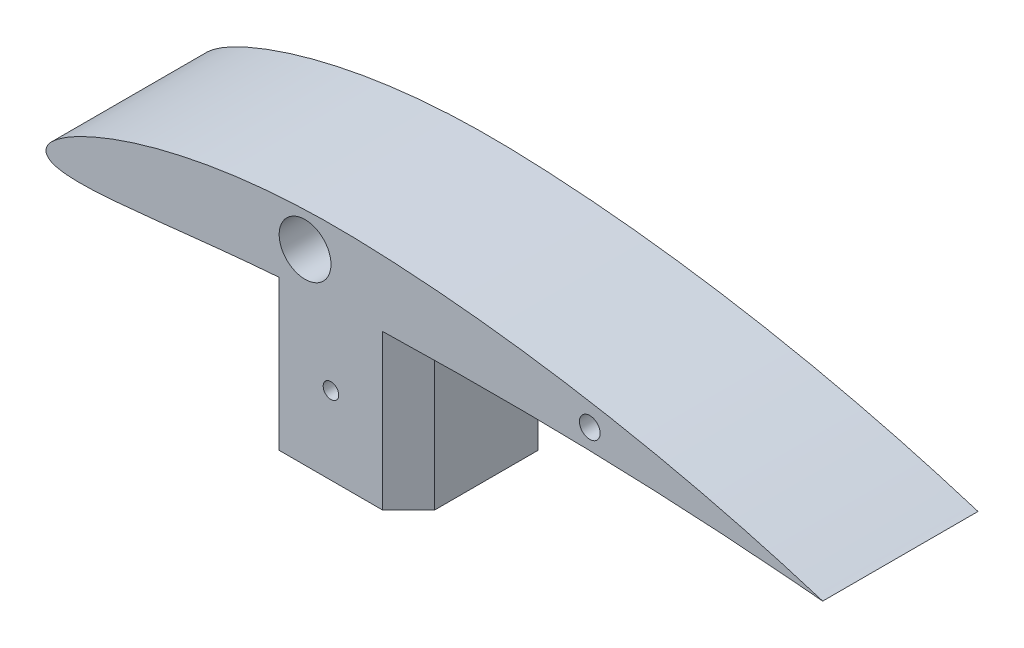
ISO-10303-21;
HEADER;
FILE_DESCRIPTION(('STEP AP214'),'2;1');
FILE_NAME('part.step','',(''),(''),'','','');
FILE_SCHEMA(('AUTOMOTIVE_DESIGN { 1 0 10303 214 1 1 1 1 }'));
ENDSEC;
DATA;
#1=APPLICATION_CONTEXT('core data for automotive mechanical design processes');
#2=APPLICATION_PROTOCOL_DEFINITION('international standard','automotive_design',2000,#1);
#3=PRODUCT_CONTEXT('',#1,'mechanical');
#4=PRODUCT('Part','Part','',(#3));
#5=PRODUCT_RELATED_PRODUCT_CATEGORY('part','',(#4));
#6=PRODUCT_DEFINITION_FORMATION('','',#4);
#7=PRODUCT_DEFINITION_CONTEXT('part definition',#1,'design');
#8=PRODUCT_DEFINITION('design','',#6,#7);
#9=PRODUCT_DEFINITION_SHAPE('','',#8);
#10=(LENGTH_UNIT() NAMED_UNIT(*) SI_UNIT(.MILLI.,.METRE.));
#11=(NAMED_UNIT(*) PLANE_ANGLE_UNIT() SI_UNIT($,.RADIAN.));
#12=(NAMED_UNIT(*) SI_UNIT($,.STERADIAN.) SOLID_ANGLE_UNIT());
#13=UNCERTAINTY_MEASURE_WITH_UNIT(LENGTH_MEASURE(1.E-05),#10,'distance_accuracy_value','');
#14=(GEOMETRIC_REPRESENTATION_CONTEXT(3) GLOBAL_UNCERTAINTY_ASSIGNED_CONTEXT((#13)) GLOBAL_UNIT_ASSIGNED_CONTEXT((#10,
#11,#12)) REPRESENTATION_CONTEXT('',''));
#15=CARTESIAN_POINT('',(0.,0.,0.));
#16=DIRECTION('',(0.,0.,1.));
#17=DIRECTION('',(1.,0.,0.));
#18=AXIS2_PLACEMENT_3D('',#15,#16,#17);
#19=CARTESIAN_POINT('',(150.,0.,30.));
#20=CARTESIAN_POINT('',(150.003329288098,0.014662249381793,30.));
#21=CARTESIAN_POINT('',(149.134973150672,0.248896496606749,30.));
#22=CARTESIAN_POINT('',(148.258218064726,0.55673636161131,30.));
#23=CARTESIAN_POINT('',(146.092264589263,1.19654633017886,30.));
#24=CARTESIAN_POINT('',(143.419462383613,1.99778912742205,30.));
#25=CARTESIAN_POINT('',(139.8973824949,3.00503852710572,30.));
#26=CARTESIAN_POINT('',(135.708200057128,4.15404129208978,30.));
#27=CARTESIAN_POINT('',(130.840351884607,5.42023236841713,30.));
#28=CARTESIAN_POINT('',(125.358407530837,6.75391320255883,30.));
#29=CARTESIAN_POINT('',(119.317026459778,8.12073918287746,30.));
#30=CARTESIAN_POINT('',(112.776533721808,9.47315641929216,30.));
#31=CARTESIAN_POINT('',(105.8081891408,10.7735530552266,30.));
#32=CARTESIAN_POINT('',(98.4852742353414,11.9821183236793,30.));
#33=CARTESIAN_POINT('',(90.8867289870229,13.0634556553686,30.));
#34=CARTESIAN_POINT('',(83.0963164113784,13.987889126777,30.));
#35=CARTESIAN_POINT('',(75.2008775632585,14.7296564652224,30.));
#36=CARTESIAN_POINT('',(67.2867045416149,15.2583026600307,30.));
#37=CARTESIAN_POINT('',(59.4020917517364,15.5949352264237,30.));
#38=CARTESIAN_POINT('',(51.630745923189,15.5985104910385,30.));
#39=CARTESIAN_POINT('',(44.0772108290214,15.1999156905343,30.));
#40=CARTESIAN_POINT('',(36.8788402768822,14.4541881360431,30.));
#41=CARTESIAN_POINT('',(30.1283124778648,13.3973016279451,30.));
#42=CARTESIAN_POINT('',(23.9108028217145,12.0836838142789,30.));
#43=CARTESIAN_POINT('',(18.3002624953933,10.5812507246044,30.));
#44=CARTESIAN_POINT('',(13.3638162704224,8.95525486581491,30.));
#45=CARTESIAN_POINT('',(9.15203164401697,7.28566296549237,30.));
#46=CARTESIAN_POINT('',(5.71179711056867,5.62797186627232,30.));
#47=CARTESIAN_POINT('',(3.05382609046227,4.06651589033411,30.));
#48=CARTESIAN_POINT('',(1.21164919063601,2.6132969274779,30.));
#49=CARTESIAN_POINT('',(0.085052112339767,1.33763685976724,30.));
#50=CARTESIAN_POINT('',(-0.180458674317127,-0.0525224950474071,30.));
#51=CARTESIAN_POINT('',(0.796524923320563,-1.07046827432894,30.));
#52=CARTESIAN_POINT('',(2.41295725296556,-1.53139163258686,30.));
#53=CARTESIAN_POINT('',(4.69512828229199,-1.80071088142852,30.));
#54=CARTESIAN_POINT('',(7.68815207852203,-1.81332682765504,30.));
#55=CARTESIAN_POINT('',(11.3620652219487,-1.62868851947792,30.));
#56=CARTESIAN_POINT('',(15.6799913776274,-1.26019933249983,30.));
#57=CARTESIAN_POINT('',(20.592376906984,-0.755998832845897,30.));
#58=CARTESIAN_POINT('',(26.0492057680031,-0.159719017170101,30.));
#59=CARTESIAN_POINT('',(31.9923782717827,0.483630714989271,30.));
#60=CARTESIAN_POINT('',(38.3681705496154,1.12082265392437,30.));
#61=CARTESIAN_POINT('',(45.1151729753294,1.69616204750979,30.));
#62=CARTESIAN_POINT('',(52.1753974691805,2.17132127896637,30.));
#63=CARTESIAN_POINT('',(59.5252685150396,2.4861103560316,30.));
#64=CARTESIAN_POINT('',(67.096034109242,2.66254785129545,30.));
#65=CARTESIAN_POINT('',(74.8069470177635,2.81955224948347,30.));
#66=CARTESIAN_POINT('',(82.5372963529707,2.89928914122949,30.));
#67=CARTESIAN_POINT('',(90.2001718911497,2.9073914753727,30.));
#68=CARTESIAN_POINT('',(97.7131039294619,2.83440001624777,30.));
#69=CARTESIAN_POINT('',(104.993995582754,2.68571683811821,30.));
#70=CARTESIAN_POINT('',(111.962787733179,2.46721579099941,30.));
#71=CARTESIAN_POINT('',(118.541868922386,2.19416658208878,30.));
#72=CARTESIAN_POINT('',(124.65666734329,1.87970597556436,30.));
#73=CARTESIAN_POINT('',(130.234494892084,1.5455926932117,30.));
#74=CARTESIAN_POINT('',(135.216199769319,1.20653216079122,30.));
#75=CARTESIAN_POINT('',(139.523505248161,0.887469492673937,30.));
#76=CARTESIAN_POINT('',(143.160651508115,0.594190169675158,30.));
#77=CARTESIAN_POINT('',(145.933395979494,0.365370935003347,30.));
#78=CARTESIAN_POINT('',(148.178013553918,0.152677435659765,30.));
#79=CARTESIAN_POINT('',(149.106467306683,0.10166923520628,30.));
#80=CARTESIAN_POINT('',(149.996691266853,-0.0145717249786521,30.));
#81=CARTESIAN_POINT('',(150.,0.,30.));
#82=B_SPLINE_CURVE_WITH_KNOTS('',3,(#19,#20,#21,#22,#23,#24,#25,#26,#27,#28,#29,#30,#31,#32,#33,
#34,#35,#36,#37,#38,#39,#40,#41,#42,#43,#44,#45,#46,#47,#48,#49,#50,#51,#52,#53,#54,#55,#56,#57,
#58,#59,#60,#61,#62,#63,#64,#65,#66,#67,#68,#69,#70,#71,#72,#73,#74,#75,#76,#77,#78,#79,#80,
#81),.UNSPECIFIED.,.T.,.F.,(4,1,1,1,1,1,1,1,1,1,1,1,1,1,1,1,1,1,1,1,1,1,1,1,1,1,1,1,1,1,1,1,1,1,
1,1,1,1,1,1,1,1,1,1,1,1,1,1,1,1,1,1,1,1,1,1,1,1,1,1,4),(0.,0.00137455348322322,
0.00548449728179397,0.0122733609908926,0.021682195504866,0.0335806119079947,0.0478307427867091,
0.0643059527211733,0.082777332043007,0.103063756455996,0.124929016786915,0.148149110667858,
0.172444694611559,0.197572105868171,0.223268880537162,0.249227774933554,0.275186209349679,
0.300900708934774,0.326462938278696,0.351222485186767,0.374905858971967,0.397269706218862,
0.418072413969665,0.437079533175026,0.454093093767394,0.468919631578705,0.48139171235289,
0.491447126518174,0.499023571234558,0.504293734329401,0.507921918342,0.511539686153778,
0.516780527527172,0.524216490268905,0.533991629403711,0.546033957270731,0.560220284382465,
0.576403357410148,0.594370816485922,0.613951103581465,0.634916884969972,0.657088503485649,
0.680229909573905,0.704175481107386,0.729090367406641,0.754353775526936,0.779667752347888,
0.804760119952374,0.829359338708985,0.853208710008459,0.876041363199166,0.897604065496152,
0.917662212410958,0.935969860405553,0.952309787739252,0.966502759006892,0.978350082728452,
0.987731492337842,0.994510920242662,0.998633932979557,1.),.UNSPECIFIED.);
#83=DIRECTION('',(0.,0.,-1.));
#84=VECTOR('',#83,1.);
#85=SURFACE_OF_LINEAR_EXTRUSION('',#82,#84);
#86=CARTESIAN_POINT('',(65.0000000000034,2.61175409979342,30.));
#87=VERTEX_POINT('',#86);
#88=CARTESIAN_POINT('',(44.9999999999997,1.66662306319599,30.));
#89=VERTEX_POINT('',#88);
#90=EDGE_CURVE('E129',#87,#89,#82,.T.);
#91=ORIENTED_EDGE('',*,*,#90,.F.);
#92=CARTESIAN_POINT('',(65.,2.61175409994051,30.));
#93=CARTESIAN_POINT('',(65.416659620438,2.62142063598571,29.583340379562));
#94=CARTESIAN_POINT('',(65.8333217740964,2.63086337285147,29.1666782259036));
#95=CARTESIAN_POINT('',(66.6666496089747,2.64942459962975,28.3333503910253));
#96=CARTESIAN_POINT('',(67.0833152901938,2.65854308961348,27.9166847098063));
#97=CARTESIAN_POINT('',(67.9166488223237,2.67657917812754,27.0833511776763));
#98=CARTESIAN_POINT('',(68.3333166732345,2.68549677665882,26.6666833267655));
#99=CARTESIAN_POINT('',(69.1666556501686,2.70302873442988,25.8333443498314));
#100=CARTESIAN_POINT('',(69.5833267761925,2.71164309360307,25.4166732238075));
#101=CARTESIAN_POINT('',(70.,2.72005465716392,25.));
#102=B_SPLINE_CURVE_WITH_KNOTS('',3,(#92,#93,#94,#95,#96,#97,#98,#99,#100,#101),.UNSPECIFIED.,
.F.,.F.,(4,2,2,2,4),(0.,1.76797473752359,3.53594908682297,5.30392342773221,7.07189815686568),.UNSPECIFIED.);
#103=CARTESIAN_POINT('',(70.,2.72005465716392,25.));
#104=VERTEX_POINT('',#103);
#105=EDGE_CURVE('E201',#87,#104,#102,.T.);
#106=ORIENTED_EDGE('',*,*,#105,.T.);
#107=DIRECTION('',(0.,0.,-1.));
#108=VECTOR('',#107,1.);
#109=CARTESIAN_POINT('',(70.,2.72005465716392,30.));
#110=LINE('',#109,#108);
#111=CARTESIAN_POINT('',(70.,2.72005465716392,5.00000000000002));
#112=VERTEX_POINT('',#111);
#113=EDGE_CURVE('E156',#104,#112,#110,.T.);
#114=ORIENTED_EDGE('',*,*,#113,.T.);
#115=CARTESIAN_POINT('',(70.,2.72005465716392,5.00000000000002));
#116=CARTESIAN_POINT('',(69.5833267761925,2.71164309360716,4.58332677619247));
#117=CARTESIAN_POINT('',(69.1666556501686,2.70302873443192,4.16665565016857));
#118=CARTESIAN_POINT('',(68.3333166732345,2.68549677665677,3.3333166732345));
#119=CARTESIAN_POINT('',(67.9166488223236,2.67657917812345,2.91664882232363));
#120=CARTESIAN_POINT('',(67.0833152901936,2.65854308961757,2.0833152901936));
#121=CARTESIAN_POINT('',(66.6666496089744,2.64942459964405,1.66664960897444));
#122=CARTESIAN_POINT('',(65.8333217740964,2.63086337283716,0.833321774096472));
#123=CARTESIAN_POINT('',(65.4166596204384,2.62142063593258,0.416659620438449));
#124=CARTESIAN_POINT('',(65.0000000000015,2.61175409979338,1.4883927423881E-12));
#125=B_SPLINE_CURVE_WITH_KNOTS('',3,(#115,#116,#117,#118,#119,#120,#121,#122,#123,#124),
.UNSPECIFIED.,.F.,.F.,(4,2,2,2,4),(0.,1.76797472913354,3.53594907004282,5.30392341934225,
7.07189815686595),.UNSPECIFIED.);
#126=CARTESIAN_POINT('',(65.,2.61175409994051,0.));
#127=VERTEX_POINT('',#126);
#128=EDGE_CURVE('E209',#112,#127,#125,.T.);
#129=ORIENTED_EDGE('',*,*,#128,.T.);
#130=CARTESIAN_POINT('',(150.,0.,0.));
#131=CARTESIAN_POINT('',(150.003329288098,0.014662249381793,0.));
#132=CARTESIAN_POINT('',(149.134973150672,0.248896496606749,0.));
#133=CARTESIAN_POINT('',(148.258218064726,0.55673636161131,0.));
#134=CARTESIAN_POINT('',(146.092264589263,1.19654633017886,0.));
#135=CARTESIAN_POINT('',(143.419462383613,1.99778912742205,0.));
#136=CARTESIAN_POINT('',(139.8973824949,3.00503852710572,0.));
#137=CARTESIAN_POINT('',(135.708200057128,4.15404129208978,0.));
#138=CARTESIAN_POINT('',(130.840351884607,5.42023236841713,0.));
#139=CARTESIAN_POINT('',(125.358407530837,6.75391320255883,0.));
#140=CARTESIAN_POINT('',(119.317026459778,8.12073918287746,0.));
#141=CARTESIAN_POINT('',(112.776533721808,9.47315641929216,0.));
#142=CARTESIAN_POINT('',(105.8081891408,10.7735530552266,0.));
#143=CARTESIAN_POINT('',(98.4852742353414,11.9821183236793,0.));
#144=CARTESIAN_POINT('',(90.8867289870229,13.0634556553686,0.));
#145=CARTESIAN_POINT('',(83.0963164113784,13.987889126777,0.));
#146=CARTESIAN_POINT('',(75.2008775632585,14.7296564652224,0.));
#147=CARTESIAN_POINT('',(67.2867045416149,15.2583026600307,0.));
#148=CARTESIAN_POINT('',(59.4020917517364,15.5949352264237,0.));
#149=CARTESIAN_POINT('',(51.630745923189,15.5985104910385,0.));
#150=CARTESIAN_POINT('',(44.0772108290214,15.1999156905343,0.));
#151=CARTESIAN_POINT('',(36.8788402768822,14.4541881360431,0.));
#152=CARTESIAN_POINT('',(30.1283124778648,13.3973016279451,0.));
#153=CARTESIAN_POINT('',(23.9108028217145,12.0836838142789,0.));
#154=CARTESIAN_POINT('',(18.3002624953933,10.5812507246044,0.));
#155=CARTESIAN_POINT('',(13.3638162704224,8.95525486581491,0.));
#156=CARTESIAN_POINT('',(9.15203164401697,7.28566296549237,0.));
#157=CARTESIAN_POINT('',(5.71179711056867,5.62797186627232,0.));
#158=CARTESIAN_POINT('',(3.05382609046227,4.06651589033411,0.));
#159=CARTESIAN_POINT('',(1.21164919063601,2.6132969274779,0.));
#160=CARTESIAN_POINT('',(0.085052112339767,1.33763685976724,0.));
#161=CARTESIAN_POINT('',(-0.180458674317127,-0.0525224950474071,0.));
#162=CARTESIAN_POINT('',(0.796524923320563,-1.07046827432894,0.));
#163=CARTESIAN_POINT('',(2.41295725296556,-1.53139163258686,0.));
#164=CARTESIAN_POINT('',(4.69512828229199,-1.80071088142852,0.));
#165=CARTESIAN_POINT('',(7.68815207852203,-1.81332682765504,0.));
#166=CARTESIAN_POINT('',(11.3620652219487,-1.62868851947792,0.));
#167=CARTESIAN_POINT('',(15.6799913776274,-1.26019933249983,0.));
#168=CARTESIAN_POINT('',(20.592376906984,-0.755998832845897,0.));
#169=CARTESIAN_POINT('',(26.0492057680031,-0.159719017170101,0.));
#170=CARTESIAN_POINT('',(31.9923782717827,0.483630714989271,0.));
#171=CARTESIAN_POINT('',(38.3681705496154,1.12082265392437,0.));
#172=CARTESIAN_POINT('',(45.1151729753294,1.69616204750979,0.));
#173=CARTESIAN_POINT('',(52.1753974691805,2.17132127896637,0.));
#174=CARTESIAN_POINT('',(59.5252685150396,2.4861103560316,0.));
#175=CARTESIAN_POINT('',(67.096034109242,2.66254785129545,0.));
#176=CARTESIAN_POINT('',(74.8069470177635,2.81955224948347,0.));
#177=CARTESIAN_POINT('',(82.5372963529707,2.89928914122949,0.));
#178=CARTESIAN_POINT('',(90.2001718911497,2.9073914753727,0.));
#179=CARTESIAN_POINT('',(97.7131039294619,2.83440001624777,0.));
#180=CARTESIAN_POINT('',(104.993995582754,2.68571683811821,0.));
#181=CARTESIAN_POINT('',(111.962787733179,2.46721579099941,0.));
#182=CARTESIAN_POINT('',(118.541868922386,2.19416658208878,0.));
#183=CARTESIAN_POINT('',(124.65666734329,1.87970597556436,0.));
#184=CARTESIAN_POINT('',(130.234494892084,1.5455926932117,0.));
#185=CARTESIAN_POINT('',(135.216199769319,1.20653216079122,0.));
#186=CARTESIAN_POINT('',(139.523505248161,0.887469492673937,0.));
#187=CARTESIAN_POINT('',(143.160651508115,0.594190169675158,0.));
#188=CARTESIAN_POINT('',(145.933395979494,0.365370935003347,0.));
#189=CARTESIAN_POINT('',(148.178013553918,0.152677435659765,0.));
#190=CARTESIAN_POINT('',(149.106467306683,0.10166923520628,0.));
#191=CARTESIAN_POINT('',(149.996691266853,-0.0145717249786521,0.));
#192=CARTESIAN_POINT('',(150.,0.,0.));
#193=B_SPLINE_CURVE_WITH_KNOTS('',3,(#130,#131,#132,#133,#134,#135,#136,#137,#138,#139,#140,
#141,#142,#143,#144,#145,#146,#147,#148,#149,#150,#151,#152,#153,#154,#155,#156,#157,#158,#159,
#160,#161,#162,#163,#164,#165,#166,#167,#168,#169,#170,#171,#172,#173,#174,#175,#176,#177,#178,
#179,#180,#181,#182,#183,#184,#185,#186,#187,#188,#189,#190,#191,#192),.UNSPECIFIED.,.T.,.F.,(4,
1,1,1,1,1,1,1,1,1,1,1,1,1,1,1,1,1,1,1,1,1,1,1,1,1,1,1,1,1,1,1,1,1,1,1,1,1,1,1,1,1,1,1,1,1,1,1,1,
1,1,1,1,1,1,1,1,1,1,1,4),(0.,0.00137455348322322,0.00548449728179397,0.0122733609908926,
0.021682195504866,0.0335806119079947,0.0478307427867091,0.0643059527211733,0.082777332043007,
0.103063756455996,0.124929016786915,0.148149110667858,0.172444694611559,0.197572105868171,
0.223268880537162,0.249227774933554,0.275186209349679,0.300900708934774,0.326462938278696,
0.351222485186767,0.374905858971967,0.397269706218862,0.418072413969665,0.437079533175026,
0.454093093767394,0.468919631578705,0.48139171235289,0.491447126518174,0.499023571234558,
0.504293734329401,0.507921918342,0.511539686153778,0.516780527527172,0.524216490268905,
0.533991629403711,0.546033957270731,0.560220284382465,0.576403357410148,0.594370816485922,
0.613951103581465,0.634916884969972,0.657088503485649,0.680229909573905,0.704175481107386,
0.729090367406641,0.754353775526936,0.779667752347888,0.804760119952374,0.829359338708985,
0.853208710008459,0.876041363199166,0.897604065496152,0.917662212410958,0.935969860405553,
0.952309787739252,0.966502759006892,0.978350082728452,0.987731492337842,0.994510920242662,
0.998633932979557,1.),.UNSPECIFIED.);
#194=CARTESIAN_POINT('',(44.9999999999992,1.66662306319595,0.));
#195=VERTEX_POINT('',#194);
#196=EDGE_CURVE('E173',#127,#195,#193,.T.);
#197=ORIENTED_EDGE('',*,*,#196,.T.);
#198=CARTESIAN_POINT('',(45.,1.66662306318483,0.));
#199=CARTESIAN_POINT('',(44.7221513036162,1.64536212499861,0.277848696383877));
#200=CARTESIAN_POINT('',(44.4443140824369,1.62380158158544,0.555685917563166));
#201=CARTESIAN_POINT('',(43.8886639660997,1.58009199125399,1.11133603390036));
#202=CARTESIAN_POINT('',(43.6108510708437,1.55794294682984,1.38914892915635));
#203=CARTESIAN_POINT('',(43.0552491921239,1.51306692668809,1.9447508078761));
#204=CARTESIAN_POINT('',(42.7774602086127,1.49033995214578,2.22253979138734));
#205=CARTESIAN_POINT('',(42.2219057727066,1.44431864881601,2.77809422729346));
#206=CARTESIAN_POINT('',(41.9441403203093,1.42102432008736,3.05585967969077));
#207=CARTESIAN_POINT('',(41.3886324517926,1.37387887671228,3.61136754820745));
#208=CARTESIAN_POINT('',(41.1108900357237,1.35002776087606,3.88910996427631));
#209=CARTESIAN_POINT('',(40.5554277791737,1.30177931616119,4.44457222082632));
#210=CARTESIAN_POINT('',(40.27770793879,1.27738198503916,4.72229206121004));
#211=CARTESIAN_POINT('',(40.,1.25271690675669,5.00000000000002));
#212=B_SPLINE_CURVE_WITH_KNOTS('',3,(#198,#199,#200,#201,#202,#203,#204,#205,#206,#207,#208,
#209,#210,#211),.UNSPECIFIED.,.F.,.F.,(4,2,2,2,2,2,4),(0.,1.18053635379329,2.3610677051439,
3.54159665595542,4.72212548441517,5.9026568357658,7.08319303662044),.UNSPECIFIED.);
#213=CARTESIAN_POINT('',(40.,1.25271690675669,5.00000000000002));
#214=VERTEX_POINT('',#213);
#215=EDGE_CURVE('E54',#195,#214,#212,.T.);
#216=ORIENTED_EDGE('',*,*,#215,.T.);
#217=DIRECTION('',(0.,0.,-1.));
#218=VECTOR('',#217,1.);
#219=CARTESIAN_POINT('',(40.,1.25271690675669,30.));
#220=LINE('',#219,#218);
#221=CARTESIAN_POINT('',(40.,1.25271690675669,25.));
#222=VERTEX_POINT('',#221);
#223=EDGE_CURVE('E132',#222,#214,#220,.T.);
#224=ORIENTED_EDGE('',*,*,#223,.F.);
#225=CARTESIAN_POINT('',(40.,1.25271690675669,25.));
#226=CARTESIAN_POINT('',(40.27770793879,1.27738198503913,25.2777079387899));
#227=CARTESIAN_POINT('',(40.5554277791737,1.30177931616118,25.5554277791736));
#228=CARTESIAN_POINT('',(41.1108900357237,1.35002776087607,26.1108900357236));
#229=CARTESIAN_POINT('',(41.3886324517925,1.3738788767123,26.3886324517925));
#230=CARTESIAN_POINT('',(41.9441403203092,1.42102432008733,26.9441403203092));
#231=CARTESIAN_POINT('',(42.2219057727065,1.44431864881593,27.2219057727065));
#232=CARTESIAN_POINT('',(42.7774602086127,1.49033995214585,27.7774602086126));
#233=CARTESIAN_POINT('',(43.0552491921239,1.51306692668838,28.0552491921238));
#234=CARTESIAN_POINT('',(43.6108510708436,1.55794294682955,28.6108510708436));
#235=CARTESIAN_POINT('',(43.8886639660997,1.58009199125291,28.8886639660996));
#236=CARTESIAN_POINT('',(44.4443140824368,1.62380158158651,29.4443140824367));
#237=CARTESIAN_POINT('',(44.7221513036159,1.6453621250026,29.7221513036159));
#238=CARTESIAN_POINT('',(44.9999999999995,1.66662306319597,29.9999999999995));
#239=B_SPLINE_CURVE_WITH_KNOTS('',3,(#225,#226,#227,#228,#229,#230,#231,#232,#233,#234,#235,
#236,#237,#238),.UNSPECIFIED.,.F.,.F.,(4,2,2,2,2,2,4),(0.,1.18053620085461,2.36106755220524,
3.54159638066498,4.72212533147649,5.90265668282709,7.08319303662035),.UNSPECIFIED.);
#240=EDGE_CURVE('E11',#222,#89,#239,.T.);
#241=ORIENTED_EDGE('',*,*,#240,.T.);
#242=EDGE_LOOP('',(#91,#106,#114,#129,#197,#216,#224,#241));
#243=FACE_BOUND('',#242,.T.);
#244=ADVANCED_FACE('F38',(#243),#85,.F.);
#245=CARTESIAN_POINT('',(0.868655213262158,2.19089135194776,30.));
#246=DIRECTION('',(0.,0.,-1.));
#247=DIRECTION('',(-1.,0.,0.));
#248=AXIS2_PLACEMENT_3D('',#245,#246,#247);
#249=PLANE('',#248);
#250=CARTESIAN_POINT('',(55.,-12.2799453428361,30.));
#251=DIRECTION('',(0.,0.,1.));
#252=DIRECTION('',(1.,0.,0.));
#253=AXIS2_PLACEMENT_3D('',#250,#251,#252);
#254=CIRCLE('',#253,1.5);
#255=CARTESIAN_POINT('',(56.5,-12.2799453428361,30.));
#256=VERTEX_POINT('',#255);
#257=EDGE_CURVE('E309',#256,#256,#254,.T.);
#258=ORIENTED_EDGE('',*,*,#257,.F.);
#259=EDGE_LOOP('',(#258));
#260=FACE_BOUND('',#259,.T.);
#261=DIRECTION('',(1.,0.,0.));
#262=VECTOR('',#261,1.);
#263=CARTESIAN_POINT('',(70.,-27.2799453428361,30.));
#264=LINE('',#263,#262);
#265=CARTESIAN_POINT('',(45.,-27.2799453428361,30.));
#266=VERTEX_POINT('',#265);
#267=CARTESIAN_POINT('',(65.,-27.2799453428361,30.));
#268=VERTEX_POINT('',#267);
#269=EDGE_CURVE('E127',#266,#268,#264,.T.);
#270=ORIENTED_EDGE('',*,*,#269,.T.);
#271=DIRECTION('',(0.,1.,0.));
#272=VECTOR('',#271,1.);
#273=CARTESIAN_POINT('',(65.,2.19089135194776,30.));
#274=LINE('',#273,#272);
#275=EDGE_CURVE('E131',#268,#87,#274,.T.);
#276=ORIENTED_EDGE('',*,*,#275,.T.);
#277=ORIENTED_EDGE('',*,*,#90,.T.);
#278=DIRECTION('',(0.,-1.,0.));
#279=VECTOR('',#278,1.);
#280=CARTESIAN_POINT('',(45.,2.19089135194777,30.));
#281=LINE('',#280,#279);
#282=EDGE_CURVE('E114',#89,#266,#281,.T.);
#283=ORIENTED_EDGE('',*,*,#282,.T.);
#284=EDGE_LOOP('',(#270,#276,#277,#283));
#285=FACE_BOUND('',#284,.T.);
#286=CARTESIAN_POINT('',(105.,6.55662819325187,30.));
#287=DIRECTION('',(0.,0.,1.));
#288=DIRECTION('',(1.,0.,0.));
#289=AXIS2_PLACEMENT_3D('',#286,#287,#288);
#290=CIRCLE('',#289,2.);
#291=CARTESIAN_POINT('',(107.,6.55662819325187,30.));
#292=VERTEX_POINT('',#291);
#293=EDGE_CURVE('E161',#292,#292,#290,.T.);
#294=ORIENTED_EDGE('',*,*,#293,.F.);
#295=EDGE_LOOP('',(#294));
#296=FACE_BOUND('',#295,.T.);
#297=CARTESIAN_POINT('',(50.,8.83483874764579,30.));
#298=DIRECTION('',(0.,0.,1.));
#299=DIRECTION('',(1.,0.,0.));
#300=AXIS2_PLACEMENT_3D('',#297,#298,#299);
#301=CIRCLE('',#300,5.);
#302=CARTESIAN_POINT('',(55.,8.83483874764579,30.));
#303=VERTEX_POINT('',#302);
#304=EDGE_CURVE('E169',#303,#303,#301,.T.);
#305=ORIENTED_EDGE('',*,*,#304,.F.);
#306=EDGE_LOOP('',(#305));
#307=FACE_BOUND('',#306,.T.);
#308=ADVANCED_FACE('F124',(#260,#285,#296,#307),#249,.F.);
#309=CARTESIAN_POINT('',(0.868655213262158,2.19089135194776,0.));
#310=DIRECTION('',(0.,0.,-1.));
#311=DIRECTION('',(-1.,0.,0.));
#312=AXIS2_PLACEMENT_3D('',#309,#310,#311);
#313=PLANE('',#312);
#314=CARTESIAN_POINT('',(55.,-12.2799453428361,0.));
#315=DIRECTION('',(0.,0.,1.));
#316=DIRECTION('',(1.,0.,0.));
#317=AXIS2_PLACEMENT_3D('',#314,#315,#316);
#318=CIRCLE('',#317,1.5);
#319=CARTESIAN_POINT('',(56.5,-12.2799453428361,0.));
#320=VERTEX_POINT('',#319);
#321=EDGE_CURVE('E312',#320,#320,#318,.T.);
#322=ORIENTED_EDGE('',*,*,#321,.T.);
#323=EDGE_LOOP('',(#322));
#324=FACE_BOUND('',#323,.T.);
#325=ORIENTED_EDGE('',*,*,#196,.F.);
#326=DIRECTION('',(0.,-1.,0.));
#327=VECTOR('',#326,1.);
#328=CARTESIAN_POINT('',(65.,-27.2799453428361,0.));
#329=LINE('',#328,#327);
#330=CARTESIAN_POINT('',(65.,-27.2799453428361,0.));
#331=VERTEX_POINT('',#330);
#332=EDGE_CURVE('E241',#127,#331,#329,.T.);
#333=ORIENTED_EDGE('',*,*,#332,.T.);
#334=DIRECTION('',(1.,0.,0.));
#335=VECTOR('',#334,1.);
#336=CARTESIAN_POINT('',(70.,-27.2799453428361,0.));
#337=LINE('',#336,#335);
#338=CARTESIAN_POINT('',(45.,-27.2799453428361,0.));
#339=VERTEX_POINT('',#338);
#340=EDGE_CURVE('E140',#339,#331,#337,.T.);
#341=ORIENTED_EDGE('',*,*,#340,.F.);
#342=DIRECTION('',(0.,1.,0.));
#343=VECTOR('',#342,1.);
#344=CARTESIAN_POINT('',(45.,1.2527169067567,0.));
#345=LINE('',#344,#343);
#346=EDGE_CURVE('E248',#339,#195,#345,.T.);
#347=ORIENTED_EDGE('',*,*,#346,.T.);
#348=EDGE_LOOP('',(#325,#333,#341,#347));
#349=FACE_BOUND('',#348,.T.);
#350=CARTESIAN_POINT('',(50.,8.83483874764579,0.));
#351=DIRECTION('',(0.,0.,1.));
#352=DIRECTION('',(1.,0.,0.));
#353=AXIS2_PLACEMENT_3D('',#350,#351,#352);
#354=CIRCLE('',#353,5.);
#355=CARTESIAN_POINT('',(55.,8.83483874764579,0.));
#356=VERTEX_POINT('',#355);
#357=EDGE_CURVE('E165',#356,#356,#354,.T.);
#358=ORIENTED_EDGE('',*,*,#357,.T.);
#359=EDGE_LOOP('',(#358));
#360=FACE_BOUND('',#359,.T.);
#361=CARTESIAN_POINT('',(105.,6.55662819325187,0.));
#362=DIRECTION('',(0.,0.,1.));
#363=DIRECTION('',(1.,0.,0.));
#364=AXIS2_PLACEMENT_3D('',#361,#362,#363);
#365=CIRCLE('',#364,2.);
#366=CARTESIAN_POINT('',(107.,6.55662819325187,0.));
#367=VERTEX_POINT('',#366);
#368=EDGE_CURVE('E160',#367,#367,#365,.T.);
#369=ORIENTED_EDGE('',*,*,#368,.T.);
#370=EDGE_LOOP('',(#369));
#371=FACE_BOUND('',#370,.T.);
#372=ADVANCED_FACE('F193',(#324,#349,#360,#371),#313,.T.);
#373=CARTESIAN_POINT('',(50.,8.83483874764579,30.));
#374=DIRECTION('',(0.,0.,-1.));
#375=DIRECTION('',(-1.,0.,0.));
#376=AXIS2_PLACEMENT_3D('',#373,#374,#375);
#377=CYLINDRICAL_SURFACE('',#376,5.);
#378=ORIENTED_EDGE('',*,*,#304,.T.);
#379=EDGE_LOOP('',(#378));
#380=FACE_BOUND('',#379,.T.);
#381=ORIENTED_EDGE('',*,*,#357,.F.);
#382=EDGE_LOOP('',(#381));
#383=FACE_BOUND('',#382,.T.);
#384=ADVANCED_FACE('F284',(#380,#383),#377,.F.);
#385=CARTESIAN_POINT('',(105.,6.55662819325187,30.));
#386=DIRECTION('',(0.,0.,-1.));
#387=DIRECTION('',(-1.,0.,0.));
#388=AXIS2_PLACEMENT_3D('',#385,#386,#387);
#389=CYLINDRICAL_SURFACE('',#388,2.);
#390=ORIENTED_EDGE('',*,*,#293,.T.);
#391=EDGE_LOOP('',(#390));
#392=FACE_BOUND('',#391,.T.);
#393=ORIENTED_EDGE('',*,*,#368,.F.);
#394=EDGE_LOOP('',(#393));
#395=FACE_BOUND('',#394,.T.);
#396=ADVANCED_FACE('F290',(#392,#395),#389,.F.);
#397=CARTESIAN_POINT('',(40.,2.72005465716392,30.));
#398=DIRECTION('',(1.,0.,0.));
#399=DIRECTION('',(0.,1.,0.));
#400=AXIS2_PLACEMENT_3D('',#397,#398,#399);
#401=PLANE('',#400);
#402=ORIENTED_EDGE('',*,*,#223,.T.);
#403=DIRECTION('',(0.,-1.,0.));
#404=VECTOR('',#403,1.);
#405=CARTESIAN_POINT('',(40.,-27.2799453428361,5.00000000000002));
#406=LINE('',#405,#404);
#407=CARTESIAN_POINT('',(40.,-27.2799453428361,5.00000000000002));
#408=VERTEX_POINT('',#407);
#409=EDGE_CURVE('E258',#214,#408,#406,.T.);
#410=ORIENTED_EDGE('',*,*,#409,.T.);
#411=DIRECTION('',(0.,0.,-1.));
#412=VECTOR('',#411,1.);
#413=CARTESIAN_POINT('',(40.,-27.2799453428361,30.));
#414=LINE('',#413,#412);
#415=CARTESIAN_POINT('',(40.,-27.2799453428361,25.));
#416=VERTEX_POINT('',#415);
#417=EDGE_CURVE('E145',#416,#408,#414,.T.);
#418=ORIENTED_EDGE('',*,*,#417,.F.);
#419=DIRECTION('',(0.,1.,0.));
#420=VECTOR('',#419,1.);
#421=CARTESIAN_POINT('',(40.,2.72005465716392,25.));
#422=LINE('',#421,#420);
#423=EDGE_CURVE('E68',#416,#222,#422,.T.);
#424=ORIENTED_EDGE('',*,*,#423,.T.);
#425=EDGE_LOOP('',(#402,#410,#418,#424));
#426=FACE_BOUND('',#425,.T.);
#427=ADVANCED_FACE('F277',(#426),#401,.F.);
#428=CARTESIAN_POINT('',(70.,2.72005465716392,30.));
#429=DIRECTION('',(-1.,0.,0.));
#430=DIRECTION('',(0.,0.,1.));
#431=AXIS2_PLACEMENT_3D('',#428,#429,#430);
#432=PLANE('',#431);
#433=ORIENTED_EDGE('',*,*,#113,.F.);
#434=DIRECTION('',(0.,-1.,0.));
#435=VECTOR('',#434,1.);
#436=CARTESIAN_POINT('',(70.,2.72005465716392,25.));
#437=LINE('',#436,#435);
#438=CARTESIAN_POINT('',(70.,-27.2799453428361,25.));
#439=VERTEX_POINT('',#438);
#440=EDGE_CURVE('E120',#104,#439,#437,.T.);
#441=ORIENTED_EDGE('',*,*,#440,.T.);
#442=DIRECTION('',(0.,0.,-1.));
#443=VECTOR('',#442,1.);
#444=CARTESIAN_POINT('',(70.,-27.2799453428361,30.));
#445=LINE('',#444,#443);
#446=CARTESIAN_POINT('',(70.,-27.2799453428361,5.00000000000002));
#447=VERTEX_POINT('',#446);
#448=EDGE_CURVE('E139',#439,#447,#445,.T.);
#449=ORIENTED_EDGE('',*,*,#448,.T.);
#450=DIRECTION('',(0.,1.,0.));
#451=VECTOR('',#450,1.);
#452=CARTESIAN_POINT('',(70.,2.72005465716392,5.00000000000002));
#453=LINE('',#452,#451);
#454=EDGE_CURVE('E243',#447,#112,#453,.T.);
#455=ORIENTED_EDGE('',*,*,#454,.T.);
#456=EDGE_LOOP('',(#433,#441,#449,#455));
#457=FACE_BOUND('',#456,.T.);
#458=ADVANCED_FACE('F268',(#457),#432,.F.);
#459=CARTESIAN_POINT('',(70.,-27.2799453428361,30.));
#460=DIRECTION('',(0.,1.,0.));
#461=DIRECTION('',(-1.,0.,0.));
#462=AXIS2_PLACEMENT_3D('',#459,#460,#461);
#463=PLANE('',#462);
#464=CARTESIAN_POINT('',(55.,-27.2799453428361,15.));
#465=DIRECTION('',(0.,-1.,0.));
#466=DIRECTION('',(1.,0.,0.));
#467=AXIS2_PLACEMENT_3D('',#464,#465,#466);
#468=CIRCLE('',#467,12.5);
#469=CARTESIAN_POINT('',(67.5,-27.2799453428361,15.));
#470=VERTEX_POINT('',#469);
#471=EDGE_CURVE('E151',#470,#470,#468,.T.);
#472=ORIENTED_EDGE('',*,*,#471,.F.);
#473=EDGE_LOOP('',(#472));
#474=FACE_BOUND('',#473,.T.);
#475=ORIENTED_EDGE('',*,*,#448,.F.);
#476=DIRECTION('',(0.707106781186546,0.,-0.70710678118655));
#477=VECTOR('',#476,1.);
#478=CARTESIAN_POINT('',(65.,-27.2799453428361,30.));
#479=LINE('',#478,#477);
#480=EDGE_CURVE('E137',#439,#268,#479,.F.);
#481=ORIENTED_EDGE('',*,*,#480,.T.);
#482=ORIENTED_EDGE('',*,*,#269,.F.);
#483=DIRECTION('',(0.707106781186545,0.,0.70710678118655));
#484=VECTOR('',#483,1.);
#485=CARTESIAN_POINT('',(45.,-27.2799453428361,30.));
#486=LINE('',#485,#484);
#487=EDGE_CURVE('E111',#266,#416,#486,.F.);
#488=ORIENTED_EDGE('',*,*,#487,.T.);
#489=ORIENTED_EDGE('',*,*,#417,.T.);
#490=DIRECTION('',(0.707106781186549,0.,-0.707106781186546));
#491=VECTOR('',#490,1.);
#492=CARTESIAN_POINT('',(40.,-27.2799453428361,5.00000000000002));
#493=LINE('',#492,#491);
#494=EDGE_CURVE('E119',#408,#339,#493,.T.);
#495=ORIENTED_EDGE('',*,*,#494,.T.);
#496=ORIENTED_EDGE('',*,*,#340,.T.);
#497=DIRECTION('',(0.707106781186549,0.,0.707106781186547));
#498=VECTOR('',#497,1.);
#499=CARTESIAN_POINT('',(70.,-27.2799453428361,5.00000000000002));
#500=LINE('',#499,#498);
#501=EDGE_CURVE('E240',#331,#447,#500,.T.);
#502=ORIENTED_EDGE('',*,*,#501,.T.);
#503=EDGE_LOOP('',(#475,#481,#482,#488,#489,#495,#496,#502));
#504=FACE_BOUND('',#503,.T.);
#505=ADVANCED_FACE('F135',(#474,#504),#463,.F.);
#506=CARTESIAN_POINT('',(55.,2.72005465716392,15.));
#507=DIRECTION('',(0.,-1.,0.));
#508=DIRECTION('',(1.,0.,0.));
#509=AXIS2_PLACEMENT_3D('',#506,#507,#508);
#510=CYLINDRICAL_SURFACE('',#509,12.5);
#511=CARTESIAN_POINT('',(56.5,-12.2799453428361,2.59032635400914));
#512=CARTESIAN_POINT('',(56.4999964158639,-12.3638749134313,2.59032519108325));
#513=CARTESIAN_POINT('',(56.4929320674817,-12.4478576028968,2.58946571057862));
#514=CARTESIAN_POINT('',(56.4648615935482,-12.6134876488519,2.58612177447835));
#515=CARTESIAN_POINT('',(56.4438407261951,-12.6951324406766,2.58363560070166));
#516=CARTESIAN_POINT('',(56.3884841730792,-12.853664545593,2.57732384473806));
#517=CARTESIAN_POINT('',(56.3541573139488,-12.9305549734042,2.57349915063201));
#518=CARTESIAN_POINT('',(56.2731816877897,-13.0774689138866,2.5649423750156));
#519=CARTESIAN_POINT('',(56.2265351010601,-13.1474936386201,2.5602104541034));
#520=CARTESIAN_POINT('',(56.1219857196502,-13.2790652286412,2.5503449972676));
#521=CARTESIAN_POINT('',(56.0640319862533,-13.3405714900104,2.54520970917461));
#522=CARTESIAN_POINT('',(55.9386229321744,-13.453009701917,2.53513192072713));
#523=CARTESIAN_POINT('',(55.8711671475271,-13.503941135807,2.53018942980158));
#524=CARTESIAN_POINT('',(55.728414784234,-13.5939286093042,2.52103629884692));
#525=CARTESIAN_POINT('',(55.6530949769245,-13.6329480507059,2.51682793096672));
#526=CARTESIAN_POINT('',(55.4969128836364,-13.6977695730284,2.50963643783793));
#527=CARTESIAN_POINT('',(55.4160507880428,-13.7235721077099,2.50665327052665));
#528=CARTESIAN_POINT('',(55.2514939284926,-13.7611064708878,2.50226063377372));
#529=CARTESIAN_POINT('',(55.1678147355217,-13.772905669559,2.50084363177961));
#530=CARTESIAN_POINT('',(54.9996527516657,-13.7823071424913,2.49971728169491));
#531=CARTESIAN_POINT('',(54.9151699901659,-13.7799099339152,2.50000787139827));
#532=CARTESIAN_POINT('',(54.7482571662413,-13.7610407819104,2.50225785373669));
#533=CARTESIAN_POINT('',(54.6658187812159,-13.7446412903499,2.50420865578309));
#534=CARTESIAN_POINT('',(54.5048728149544,-13.6983462669781,2.50955017888096));
#535=CARTESIAN_POINT('',(54.4263653034787,-13.6684504957453,2.51294092547671));
#536=CARTESIAN_POINT('',(54.2752844383703,-13.5959339783828,2.52079610477232));
#537=CARTESIAN_POINT('',(54.2027263513623,-13.5532817248329,2.52526319056539));
#538=CARTESIAN_POINT('',(54.0657705399006,-13.456485893358,2.53477095164195));
#539=CARTESIAN_POINT('',(54.0013731606166,-13.4023418296283,2.53981165117021));
#540=CARTESIAN_POINT('',(53.8821413943848,-13.2836931680659,2.5499396627352));
#541=CARTESIAN_POINT('',(53.8273698056081,-13.2191254521493,2.55502706837289));
#542=CARTESIAN_POINT('',(53.7294320408742,-13.0816795859963,2.56464369769627));
#543=CARTESIAN_POINT('',(53.6862658963474,-13.0088014132538,2.56917291987025));
#544=CARTESIAN_POINT('',(53.6127616082068,-12.8567490977624,2.57716039723923));
#545=CARTESIAN_POINT('',(53.5824282442118,-12.7775726222071,2.58061825327166));
#546=CARTESIAN_POINT('',(53.5355049498381,-12.6151991630855,2.58606358466942));
#547=CARTESIAN_POINT('',(53.5189144107073,-12.5320023577764,2.58805112516342));
#548=CARTESIAN_POINT('',(53.5000303564392,-12.3645037946477,2.59031899921816));
#549=CARTESIAN_POINT('',(53.4976485786462,-12.2802121248955,2.5906098719683));
#550=CARTESIAN_POINT('',(53.507017009722,-12.1124309524146,2.58947933494269));
#551=CARTESIAN_POINT('',(53.5187669415438,-12.0289414339924,2.58805795873497));
#552=CARTESIAN_POINT('',(53.5559910402899,-11.8653974510371,2.58367268625107));
#553=CARTESIAN_POINT('',(53.5814226875053,-11.7853331694314,2.58071356989208));
#554=CARTESIAN_POINT('',(53.6452446160369,-11.6306057013481,2.57359010733758));
#555=CARTESIAN_POINT('',(53.683635318707,-11.5559426905846,2.56942572195429));
#556=CARTESIAN_POINT('',(53.772503486392,-11.4137371953488,2.56033563433504));
#557=CARTESIAN_POINT('',(53.8230389642926,-11.3462311993954,2.55540631950722));
#558=CARTESIAN_POINT('',(53.9346799108165,-11.2206277863302,2.54535322298155));
#559=CARTESIAN_POINT('',(53.9957857577819,-11.1625307061331,2.54022943432808));
#560=CARTESIAN_POINT('',(54.1272178636662,-11.0570854692186,2.53033245275448));
#561=CARTESIAN_POINT('',(54.1975907502911,-11.0097952195804,2.52556123719847));
#562=CARTESIAN_POINT('',(54.3453317852947,-10.9277062381715,2.51693637844199));
#563=CARTESIAN_POINT('',(54.4226998021778,-10.8929072716489,2.51308271799812));
#564=CARTESIAN_POINT('',(54.58204037764,-10.8368848403982,2.50673597847429));
#565=CARTESIAN_POINT('',(54.6640009146764,-10.8156275828939,2.50423951486858));
#566=CARTESIAN_POINT('',(54.8303597075043,-10.787181971045,2.50087443177464));
#567=CARTESIAN_POINT('',(54.9147578622694,-10.7799930344895,2.50000574492171));
#568=CARTESIAN_POINT('',(55.0830300031279,-10.7798984207799,2.49999434756764));
#569=CARTESIAN_POINT('',(55.1669039523295,-10.7869033244945,2.50084083173755));
#570=CARTESIAN_POINT('',(55.3322736123981,-10.8148085702873,2.50414322989645));
#571=CARTESIAN_POINT('',(55.4137693240448,-10.8357089078108,2.50659914335787));
#572=CARTESIAN_POINT('',(55.5720597779918,-10.8907843504019,2.51284559902552));
#573=CARTESIAN_POINT('',(55.648855904374,-10.9249555250633,2.51663574604251));
#574=CARTESIAN_POINT('',(55.7956377052627,-11.0055933776283,2.52513037784195));
#575=CARTESIAN_POINT('',(55.8656233246469,-11.0520601550375,2.52983487002391));
#576=CARTESIAN_POINT('',(55.9972547421243,-11.1563021838392,2.53966803188683));
#577=CARTESIAN_POINT('',(56.0588476339384,-11.214144020499,2.54479909119542));
#578=CARTESIAN_POINT('',(56.1714886535621,-11.3393568614123,2.55488765677045));
#579=CARTESIAN_POINT('',(56.2225342740655,-11.4067301250867,2.55984512153778));
#580=CARTESIAN_POINT('',(56.3127853736437,-11.5493668109213,2.56904403962361));
#581=CARTESIAN_POINT('',(56.3519479910016,-11.6246575069726,2.57328287717954));
#582=CARTESIAN_POINT('',(56.4170190291187,-11.7807542197115,2.58053388116301));
#583=CARTESIAN_POINT('',(56.4429419821302,-11.861554078435,2.58354739180188));
#584=CARTESIAN_POINT('',(56.4745350503682,-11.9989751123888,2.5872686381506));
#585=CARTESIAN_POINT('',(56.4840708247098,-12.054726718816,2.58840963450246));
#586=CARTESIAN_POINT('',(56.4968044845476,-12.1669593089032,2.58993888134724));
#587=CARTESIAN_POINT('',(56.5000024129971,-12.2234402876174,2.59032713694168));
#588=CARTESIAN_POINT('',(56.5,-12.2799453428361,2.59032635400914));
#589=B_SPLINE_CURVE_WITH_KNOTS('',3,(#511,#512,#513,#514,#515,#516,#517,#518,#519,#520,#521,
#522,#523,#524,#525,#526,#527,#528,#529,#530,#531,#532,#533,#534,#535,#536,#537,#538,#539,#540,
#541,#542,#543,#544,#545,#546,#547,#548,#549,#550,#551,#552,#553,#554,#555,#556,#557,#558,#559,
#560,#561,#562,#563,#564,#565,#566,#567,#568,#569,#570,#571,#572,#573,#574,#575,#576,#577,#578,
#579,#580,#581,#582,#583,#584,#585,#586,#587,#588),.UNSPECIFIED.,.T.,.F.,(4,2,2,2,2,2,2,2,2,2,2,
2,2,2,2,2,2,2,2,2,2,2,2,2,2,2,2,2,2,2,2,2,2,2,2,2,2,2,4),(0.,0.25158230660961,0.503430774819314,
0.755112462522265,1.0067496383611,1.25954776660377,1.51235824273611,1.76593780876769,
2.01950866836447,2.27185458608053,2.52419131111312,2.77523023079345,3.02627360403336,
3.27794222677636,3.52962149067919,3.78288622204423,4.0361516393056,4.28951130338295,
4.54285974404083,4.79463277043149,5.04640086098251,5.29739099483106,5.54838929022029,
5.8006112515531,6.05284224246469,6.30639464647641,6.55994228515921,6.81285470170489,
7.0657566513693,7.31707030939078,7.56838388503439,7.81962308616499,8.07086432058378,
8.32362252061908,8.57644073759114,8.83016031080825,9.08360079205965,9.25297814464874,
9.42235434931911),.UNSPECIFIED.);
#590=CARTESIAN_POINT('',(56.5,-12.2799453428361,2.59032635400914));
#591=VERTEX_POINT('',#590);
#592=EDGE_CURVE('E43',#591,#591,#589,.T.);
#593=ORIENTED_EDGE('',*,*,#592,.T.);
#594=EDGE_LOOP('',(#593));
#595=FACE_BOUND('',#594,.T.);
#596=CARTESIAN_POINT('',(56.5,-12.2799453428361,27.4096736459909));
#597=CARTESIAN_POINT('',(56.4999964158639,-12.1960157722409,27.4096748089167));
#598=CARTESIAN_POINT('',(56.4929320674817,-12.1120330827754,27.4105342894214));
#599=CARTESIAN_POINT('',(56.4648615935482,-11.9464030368203,27.4138782255216));
#600=CARTESIAN_POINT('',(56.4438407261951,-11.8647582449956,27.4163643992983));
#601=CARTESIAN_POINT('',(56.3884841730792,-11.7062261400792,27.4226761552619));
#602=CARTESIAN_POINT('',(56.3541573139488,-11.629335712268,27.426500849368));
#603=CARTESIAN_POINT('',(56.2731816877897,-11.4824217717856,27.4350576249844));
#604=CARTESIAN_POINT('',(56.2265351010601,-11.4123970470521,27.4397895458966));
#605=CARTESIAN_POINT('',(56.1219857196502,-11.280825457031,27.4496550027324));
#606=CARTESIAN_POINT('',(56.0640319862533,-11.2193191956618,27.4547902908254));
#607=CARTESIAN_POINT('',(55.9386229321744,-11.1068809837551,27.4648680792729));
#608=CARTESIAN_POINT('',(55.8711671475271,-11.0559495498652,27.4698105701984));
#609=CARTESIAN_POINT('',(55.728414784234,-10.9659620763679,27.4789637011531));
#610=CARTESIAN_POINT('',(55.6530949769245,-10.9269426349663,27.4831720690333));
#611=CARTESIAN_POINT('',(55.4969128836364,-10.8621211126437,27.4903635621621));
#612=CARTESIAN_POINT('',(55.4160507880428,-10.8363185779622,27.4933467294733));
#613=CARTESIAN_POINT('',(55.2514939284926,-10.7987842147843,27.4977393662263));
#614=CARTESIAN_POINT('',(55.1678147355217,-10.7869850161132,27.4991563682204));
#615=CARTESIAN_POINT('',(54.9996527516657,-10.7775835431808,27.5002827183051));
#616=CARTESIAN_POINT('',(54.9151699901659,-10.779980751757,27.4999921286017));
#617=CARTESIAN_POINT('',(54.7482571662413,-10.7988499037618,27.4977421462633));
#618=CARTESIAN_POINT('',(54.6658187812159,-10.8152493953223,27.4957913442169));
#619=CARTESIAN_POINT('',(54.5048728149544,-10.8615444186941,27.490449821119));
#620=CARTESIAN_POINT('',(54.4263653034787,-10.8914401899269,27.4870590745233));
#621=CARTESIAN_POINT('',(54.2752844383703,-10.9639567072893,27.4792038952277));
#622=CARTESIAN_POINT('',(54.2027263513623,-11.0066089608393,27.4747368094346));
#623=CARTESIAN_POINT('',(54.0657705399006,-11.1034047923142,27.465229048358));
#624=CARTESIAN_POINT('',(54.0013731606166,-11.1575488560439,27.4601883488298));
#625=CARTESIAN_POINT('',(53.8821413943848,-11.2761975176063,27.4500603372648));
#626=CARTESIAN_POINT('',(53.8273698056081,-11.3407652335228,27.4449729316271));
#627=CARTESIAN_POINT('',(53.7294320408742,-11.4782110996758,27.4353563023037));
#628=CARTESIAN_POINT('',(53.6862658963474,-11.5510892724183,27.4308270801297));
#629=CARTESIAN_POINT('',(53.6127616082068,-11.7031415879098,27.4228396027608));
#630=CARTESIAN_POINT('',(53.5824282442118,-11.782318063465,27.4193817467283));
#631=CARTESIAN_POINT('',(53.5355049498381,-11.9446915225867,27.4139364153306));
#632=CARTESIAN_POINT('',(53.5189144107073,-12.0278883278957,27.4119488748366));
#633=CARTESIAN_POINT('',(53.5000303564392,-12.1953868910244,27.4096810007818));
#634=CARTESIAN_POINT('',(53.4976485786462,-12.2796785607766,27.4093901280317));
#635=CARTESIAN_POINT('',(53.507017009722,-12.4474597332575,27.4105206650573));
#636=CARTESIAN_POINT('',(53.5187669415438,-12.5309492516798,27.411942041265));
#637=CARTESIAN_POINT('',(53.5559910402899,-12.6944932346351,27.4163273137489));
#638=CARTESIAN_POINT('',(53.5814226875053,-12.7745575162407,27.4192864301079));
#639=CARTESIAN_POINT('',(53.6452446160369,-12.9292849843241,27.4264098926624));
#640=CARTESIAN_POINT('',(53.683635318707,-13.0039479950876,27.4305742780457));
#641=CARTESIAN_POINT('',(53.772503486392,-13.1461534903234,27.4396643656649));
#642=CARTESIAN_POINT('',(53.8230389642926,-13.2136594862767,27.4445936804928));
#643=CARTESIAN_POINT('',(53.9346799108165,-13.339262899342,27.4546467770184));
#644=CARTESIAN_POINT('',(53.9957857577819,-13.397359979539,27.4597705656719));
#645=CARTESIAN_POINT('',(54.1272178636662,-13.5028052164535,27.4696675472455));
#646=CARTESIAN_POINT('',(54.1975907502911,-13.5500954660918,27.4744387628015));
#647=CARTESIAN_POINT('',(54.3453317852947,-13.6321844475006,27.483063621558));
#648=CARTESIAN_POINT('',(54.4226998021778,-13.6669834140233,27.4869172820019));
#649=CARTESIAN_POINT('',(54.58204037764,-13.723005845274,27.4932640215257));
#650=CARTESIAN_POINT('',(54.6640009146764,-13.7442631027782,27.4957604851314));
#651=CARTESIAN_POINT('',(54.8303597075043,-13.7727087146272,27.4991255682254));
#652=CARTESIAN_POINT('',(54.9147578622694,-13.7798976511827,27.4999942550783));
#653=CARTESIAN_POINT('',(55.0830300031279,-13.7799922648922,27.5000056524324));
#654=CARTESIAN_POINT('',(55.1669039523295,-13.7729873611777,27.4991591682624));
#655=CARTESIAN_POINT('',(55.3322736123981,-13.7450821153848,27.4958567701035));
#656=CARTESIAN_POINT('',(55.4137693240448,-13.7241817778613,27.4934008566421));
#657=CARTESIAN_POINT('',(55.5720597779918,-13.6691063352703,27.4871544009745));
#658=CARTESIAN_POINT('',(55.648855904374,-13.6349351606088,27.4833642539575));
#659=CARTESIAN_POINT('',(55.7956377052627,-13.5542973080439,27.474869622158));
#660=CARTESIAN_POINT('',(55.8656233246469,-13.5078305306346,27.4701651299761));
#661=CARTESIAN_POINT('',(55.9972547421243,-13.403588501833,27.4603319681132));
#662=CARTESIAN_POINT('',(56.0588476339384,-13.3457466651732,27.4552009088046));
#663=CARTESIAN_POINT('',(56.1714886535621,-13.2205338242599,27.4451123432295));
#664=CARTESIAN_POINT('',(56.2225342740655,-13.1531605605854,27.4401548784622));
#665=CARTESIAN_POINT('',(56.3127853736437,-13.0105238747508,27.4309559603764));
#666=CARTESIAN_POINT('',(56.3519479910016,-12.9352331786996,27.4267171228205));
#667=CARTESIAN_POINT('',(56.4170190291187,-12.7791364659607,27.419466118837));
#668=CARTESIAN_POINT('',(56.4429419821302,-12.6983366072372,27.4164526081981));
#669=CARTESIAN_POINT('',(56.4745350503682,-12.5609155732834,27.4127313618494));
#670=CARTESIAN_POINT('',(56.4840708247098,-12.5051639668561,27.4115903654975));
#671=CARTESIAN_POINT('',(56.4968044845476,-12.392931376769,27.4100611186528));
#672=CARTESIAN_POINT('',(56.5000024129971,-12.3364503980548,27.4096728630583));
#673=CARTESIAN_POINT('',(56.5,-12.2799453428361,27.4096736459909));
#674=B_SPLINE_CURVE_WITH_KNOTS('',3,(#596,#597,#598,#599,#600,#601,#602,#603,#604,#605,#606,
#607,#608,#609,#610,#611,#612,#613,#614,#615,#616,#617,#618,#619,#620,#621,#622,#623,#624,#625,
#626,#627,#628,#629,#630,#631,#632,#633,#634,#635,#636,#637,#638,#639,#640,#641,#642,#643,#644,
#645,#646,#647,#648,#649,#650,#651,#652,#653,#654,#655,#656,#657,#658,#659,#660,#661,#662,#663,
#664,#665,#666,#667,#668,#669,#670,#671,#672,#673),.UNSPECIFIED.,.T.,.F.,(4,2,2,2,2,2,2,2,2,2,2,
2,2,2,2,2,2,2,2,2,2,2,2,2,2,2,2,2,2,2,2,2,2,2,2,2,2,2,4),(0.,0.25158230660961,0.503430774819314,
0.755112462522265,1.0067496383611,1.25954776660377,1.51235824273611,1.76593780876769,
2.01950866836447,2.27185458608053,2.52419131111312,2.77523023079345,3.02627360403336,
3.27794222677636,3.52962149067919,3.78288622204423,4.0361516393056,4.28951130338295,
4.54285974404083,4.79463277043149,5.04640086098251,5.29739099483106,5.54838929022029,
5.8006112515531,6.05284224246469,6.3063946464764,6.5599422851592,6.81285470170489,
7.0657566513693,7.31707030939078,7.56838388503439,7.819623086165,8.07086432058378,
8.32362252061908,8.57644073759114,8.83016031080825,9.08360079205965,9.25297814464874,
9.42235434931911),.UNSPECIFIED.);
#675=CARTESIAN_POINT('',(56.5,-12.2799453428361,27.4096736459909));
#676=VERTEX_POINT('',#675);
#677=EDGE_CURVE('E316',#676,#676,#674,.T.);
#678=ORIENTED_EDGE('',*,*,#677,.T.);
#679=EDGE_LOOP('',(#678));
#680=FACE_BOUND('',#679,.T.);
#681=CARTESIAN_POINT('',(55.,2.72005465716392,15.));
#682=DIRECTION('',(0.,-1.,0.));
#683=DIRECTION('',(1.,0.,0.));
#684=AXIS2_PLACEMENT_3D('',#681,#682,#683);
#685=CIRCLE('',#684,12.5);
#686=CARTESIAN_POINT('',(67.5,2.72005465716392,15.));
#687=VERTEX_POINT('',#686);
#688=EDGE_CURVE('E148',#687,#687,#685,.T.);
#689=ORIENTED_EDGE('',*,*,#688,.F.);
#690=EDGE_LOOP('',(#689));
#691=FACE_BOUND('',#690,.T.);
#692=ORIENTED_EDGE('',*,*,#471,.T.);
#693=EDGE_LOOP('',(#692));
#694=FACE_BOUND('',#693,.T.);
#695=ADVANCED_FACE('F337',(#595,#680,#691,#694),#510,.F.);
#696=CARTESIAN_POINT('',(55.,2.72005465716392,15.));
#697=DIRECTION('',(0.,-1.,0.));
#698=DIRECTION('',(1.,0.,0.));
#699=AXIS2_PLACEMENT_3D('',#696,#697,#698);
#700=PLANE('',#699);
#701=ORIENTED_EDGE('',*,*,#688,.T.);
#702=EDGE_LOOP('',(#701));
#703=FACE_BOUND('',#702,.T.);
#704=ADVANCED_FACE('F235',(#703),#700,.T.);
#705=CARTESIAN_POINT('',(65.,2.19089135194776,30.));
#706=DIRECTION('',(-0.707106781186549,0.,-0.707106781186545));
#707=DIRECTION('',(0.,1.,0.));
#708=AXIS2_PLACEMENT_3D('',#705,#706,#707);
#709=PLANE('',#708);
#710=ORIENTED_EDGE('',*,*,#480,.F.);
#711=ORIENTED_EDGE('',*,*,#440,.F.);
#712=ORIENTED_EDGE('',*,*,#105,.F.);
#713=ORIENTED_EDGE('',*,*,#275,.F.);
#714=EDGE_LOOP('',(#710,#711,#712,#713));
#715=FACE_BOUND('',#714,.T.);
#716=ADVANCED_FACE('F195',(#715),#709,.F.);
#717=CARTESIAN_POINT('',(70.,2.72005465716392,5.00000000000002));
#718=DIRECTION('',(0.707106781186546,0.,-0.707106781186548));
#719=DIRECTION('',(0.,-1.,0.));
#720=AXIS2_PLACEMENT_3D('',#717,#718,#719);
#721=PLANE('',#720);
#722=ORIENTED_EDGE('',*,*,#501,.F.);
#723=ORIENTED_EDGE('',*,*,#332,.F.);
#724=ORIENTED_EDGE('',*,*,#128,.F.);
#725=ORIENTED_EDGE('',*,*,#454,.F.);
#726=EDGE_LOOP('',(#722,#723,#724,#725));
#727=FACE_BOUND('',#726,.T.);
#728=ADVANCED_FACE('F227',(#727),#721,.T.);
#729=CARTESIAN_POINT('',(40.,2.72005465716392,5.00000000000002));
#730=DIRECTION('',(-0.707106781186546,0.,-0.707106781186549));
#731=DIRECTION('',(0.,1.,0.));
#732=AXIS2_PLACEMENT_3D('',#729,#730,#731);
#733=PLANE('',#732);
#734=ORIENTED_EDGE('',*,*,#215,.F.);
#735=ORIENTED_EDGE('',*,*,#346,.F.);
#736=ORIENTED_EDGE('',*,*,#494,.F.);
#737=ORIENTED_EDGE('',*,*,#409,.F.);
#738=EDGE_LOOP('',(#734,#735,#736,#737));
#739=FACE_BOUND('',#738,.T.);
#740=ADVANCED_FACE('F224',(#739),#733,.T.);
#741=CARTESIAN_POINT('',(45.,2.19089135194777,30.));
#742=DIRECTION('',(0.70710678118655,0.,-0.707106781186545));
#743=DIRECTION('',(0.,-1.,0.));
#744=AXIS2_PLACEMENT_3D('',#741,#742,#743);
#745=PLANE('',#744);
#746=ORIENTED_EDGE('',*,*,#240,.F.);
#747=ORIENTED_EDGE('',*,*,#423,.F.);
#748=ORIENTED_EDGE('',*,*,#487,.F.);
#749=ORIENTED_EDGE('',*,*,#282,.F.);
#750=EDGE_LOOP('',(#746,#747,#748,#749));
#751=FACE_BOUND('',#750,.T.);
#752=ADVANCED_FACE('F40',(#751),#745,.F.);
#753=CARTESIAN_POINT('',(55.,-12.2799453428361,0.));
#754=DIRECTION('',(0.,0.,1.));
#755=DIRECTION('',(1.,0.,0.));
#756=AXIS2_PLACEMENT_3D('',#753,#754,#755);
#757=CYLINDRICAL_SURFACE('',#756,1.5);
#758=ORIENTED_EDGE('',*,*,#257,.T.);
#759=EDGE_LOOP('',(#758));
#760=FACE_BOUND('',#759,.T.);
#761=ORIENTED_EDGE('',*,*,#677,.F.);
#762=EDGE_LOOP('',(#761));
#763=FACE_BOUND('',#762,.T.);
#764=ADVANCED_FACE('F344',(#760,#763),#757,.F.);
#765=ORIENTED_EDGE('',*,*,#321,.F.);
#766=EDGE_LOOP('',(#765));
#767=FACE_BOUND('',#766,.T.);
#768=ORIENTED_EDGE('',*,*,#592,.F.);
#769=EDGE_LOOP('',(#768));
#770=FACE_BOUND('',#769,.T.);
#771=ADVANCED_FACE('F341',(#767,#770),#757,.F.);
#772=CLOSED_SHELL('',(#244,#308,#372,#384,#396,#427,#458,#505,#695,#704,#716,#728,#740,#752,
#764,#771));
#773=MANIFOLD_SOLID_BREP('B2',#772);
#774=ADVANCED_BREP_SHAPE_REPRESENTATION('',(#18,#773),#14);
#775=SHAPE_DEFINITION_REPRESENTATION(#9,#774);
ENDSEC;
END-ISO-10303-21;
